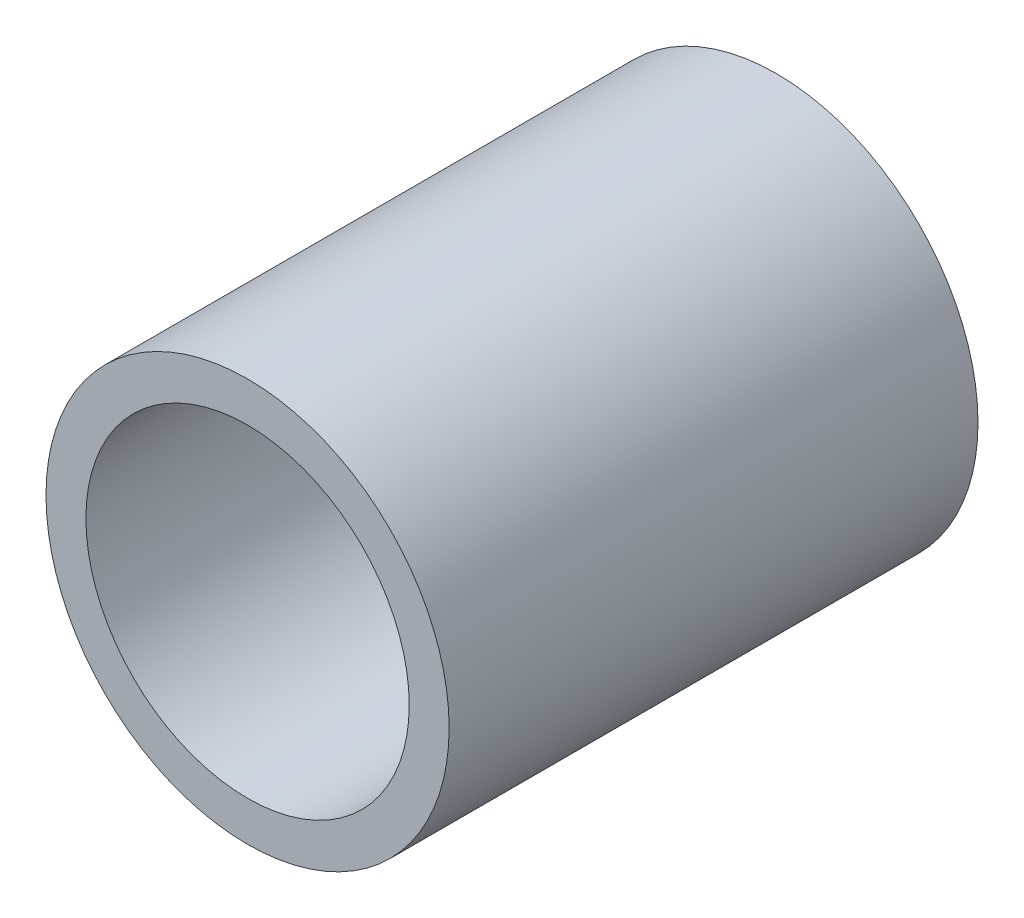
ISO-10303-21;
HEADER;
FILE_DESCRIPTION(('STEP AP214'),'2;1');
FILE_NAME('part.step','',(''),(''),'','','');
FILE_SCHEMA(('AUTOMOTIVE_DESIGN { 1 0 10303 214 1 1 1 1 }'));
ENDSEC;
DATA;
#1=APPLICATION_CONTEXT('core data for automotive mechanical design processes');
#2=APPLICATION_PROTOCOL_DEFINITION('international standard','automotive_design',2000,#1);
#3=PRODUCT_CONTEXT('',#1,'mechanical');
#4=PRODUCT('Part','Part','',(#3));
#5=PRODUCT_RELATED_PRODUCT_CATEGORY('part','',(#4));
#6=PRODUCT_DEFINITION_FORMATION('','',#4);
#7=PRODUCT_DEFINITION_CONTEXT('part definition',#1,'design');
#8=PRODUCT_DEFINITION('design','',#6,#7);
#9=PRODUCT_DEFINITION_SHAPE('','',#8);
#10=(LENGTH_UNIT() NAMED_UNIT(*) SI_UNIT(.MILLI.,.METRE.));
#11=(NAMED_UNIT(*) PLANE_ANGLE_UNIT() SI_UNIT($,.RADIAN.));
#12=(NAMED_UNIT(*) SI_UNIT($,.STERADIAN.) SOLID_ANGLE_UNIT());
#13=UNCERTAINTY_MEASURE_WITH_UNIT(LENGTH_MEASURE(1.E-05),#10,'distance_accuracy_value','');
#14=(GEOMETRIC_REPRESENTATION_CONTEXT(3) GLOBAL_UNCERTAINTY_ASSIGNED_CONTEXT((#13)) GLOBAL_UNIT_ASSIGNED_CONTEXT((#10,
#11,#12)) REPRESENTATION_CONTEXT('',''));
#15=CARTESIAN_POINT('',(0.,0.,0.));
#16=DIRECTION('',(0.,0.,1.));
#17=DIRECTION('',(1.,0.,0.));
#18=AXIS2_PLACEMENT_3D('',#15,#16,#17);
#19=CARTESIAN_POINT('',(0.,0.,13.25));
#20=DIRECTION('',(0.,0.,1.));
#21=DIRECTION('',(1.,0.,0.));
#22=AXIS2_PLACEMENT_3D('',#19,#20,#21);
#23=PLANE('',#22);
#24=CARTESIAN_POINT('',(0.,0.,13.25));
#25=DIRECTION('',(0.,0.,1.));
#26=DIRECTION('',(1.,0.,0.));
#27=AXIS2_PLACEMENT_3D('',#24,#25,#26);
#28=CIRCLE('',#27,5.05);
#29=CARTESIAN_POINT('',(5.05,0.,13.25));
#30=VERTEX_POINT('',#29);
#31=EDGE_CURVE('E11',#30,#30,#28,.T.);
#32=ORIENTED_EDGE('',*,*,#31,.T.);
#33=EDGE_LOOP('',(#32));
#34=FACE_BOUND('',#33,.T.);
#35=CARTESIAN_POINT('',(0.,0.,13.25));
#36=DIRECTION('',(0.,0.,1.));
#37=DIRECTION('',(1.,0.,0.));
#38=AXIS2_PLACEMENT_3D('',#35,#36,#37);
#39=CIRCLE('',#38,4.05);
#40=CARTESIAN_POINT('',(4.05,0.,13.25));
#41=VERTEX_POINT('',#40);
#42=EDGE_CURVE('E57',#41,#41,#39,.T.);
#43=ORIENTED_EDGE('',*,*,#42,.F.);
#44=EDGE_LOOP('',(#43));
#45=FACE_BOUND('',#44,.T.);
#46=ADVANCED_FACE('F44',(#34,#45),#23,.T.);
#47=CARTESIAN_POINT('',(0.,0.,0.));
#48=DIRECTION('',(0.,0.,1.));
#49=DIRECTION('',(1.,0.,0.));
#50=AXIS2_PLACEMENT_3D('',#47,#48,#49);
#51=PLANE('',#50);
#52=CARTESIAN_POINT('',(0.,0.,0.));
#53=DIRECTION('',(0.,0.,1.));
#54=DIRECTION('',(1.,0.,0.));
#55=AXIS2_PLACEMENT_3D('',#52,#53,#54);
#56=CIRCLE('',#55,5.05);
#57=CARTESIAN_POINT('',(5.05,0.,0.));
#58=VERTEX_POINT('',#57);
#59=EDGE_CURVE('E47',#58,#58,#56,.T.);
#60=ORIENTED_EDGE('',*,*,#59,.F.);
#61=EDGE_LOOP('',(#60));
#62=FACE_BOUND('',#61,.T.);
#63=CARTESIAN_POINT('',(0.,0.,0.));
#64=DIRECTION('',(0.,0.,1.));
#65=DIRECTION('',(1.,0.,0.));
#66=AXIS2_PLACEMENT_3D('',#63,#64,#65);
#67=CIRCLE('',#66,4.05);
#68=CARTESIAN_POINT('',(4.05,0.,0.));
#69=VERTEX_POINT('',#68);
#70=EDGE_CURVE('E59',#69,#69,#67,.T.);
#71=ORIENTED_EDGE('',*,*,#70,.T.);
#72=EDGE_LOOP('',(#71));
#73=FACE_BOUND('',#72,.T.);
#74=ADVANCED_FACE('F69',(#62,#73),#51,.F.);
#75=CARTESIAN_POINT('',(0.,0.,13.25));
#76=DIRECTION('',(0.,0.,-1.));
#77=DIRECTION('',(-1.,0.,0.));
#78=AXIS2_PLACEMENT_3D('',#75,#76,#77);
#79=CYLINDRICAL_SURFACE('',#78,5.05);
#80=ORIENTED_EDGE('',*,*,#31,.F.);
#81=EDGE_LOOP('',(#80));
#82=FACE_BOUND('',#81,.T.);
#83=ORIENTED_EDGE('',*,*,#59,.T.);
#84=EDGE_LOOP('',(#83));
#85=FACE_BOUND('',#84,.T.);
#86=ADVANCED_FACE('F50',(#82,#85),#79,.T.);
#87=CARTESIAN_POINT('',(0.,0.,13.25));
#88=DIRECTION('',(0.,0.,-1.));
#89=DIRECTION('',(-1.,0.,0.));
#90=AXIS2_PLACEMENT_3D('',#87,#88,#89);
#91=CYLINDRICAL_SURFACE('',#90,4.05);
#92=ORIENTED_EDGE('',*,*,#42,.T.);
#93=EDGE_LOOP('',(#92));
#94=FACE_BOUND('',#93,.T.);
#95=ORIENTED_EDGE('',*,*,#70,.F.);
#96=EDGE_LOOP('',(#95));
#97=FACE_BOUND('',#96,.T.);
#98=ADVANCED_FACE('F63',(#94,#97),#91,.F.);
#99=CLOSED_SHELL('',(#46,#74,#86,#98));
#100=MANIFOLD_SOLID_BREP('B2',#99);
#101=ADVANCED_BREP_SHAPE_REPRESENTATION('',(#18,#100),#14);
#102=SHAPE_DEFINITION_REPRESENTATION(#9,#101);
ENDSEC;
END-ISO-10303-21;
